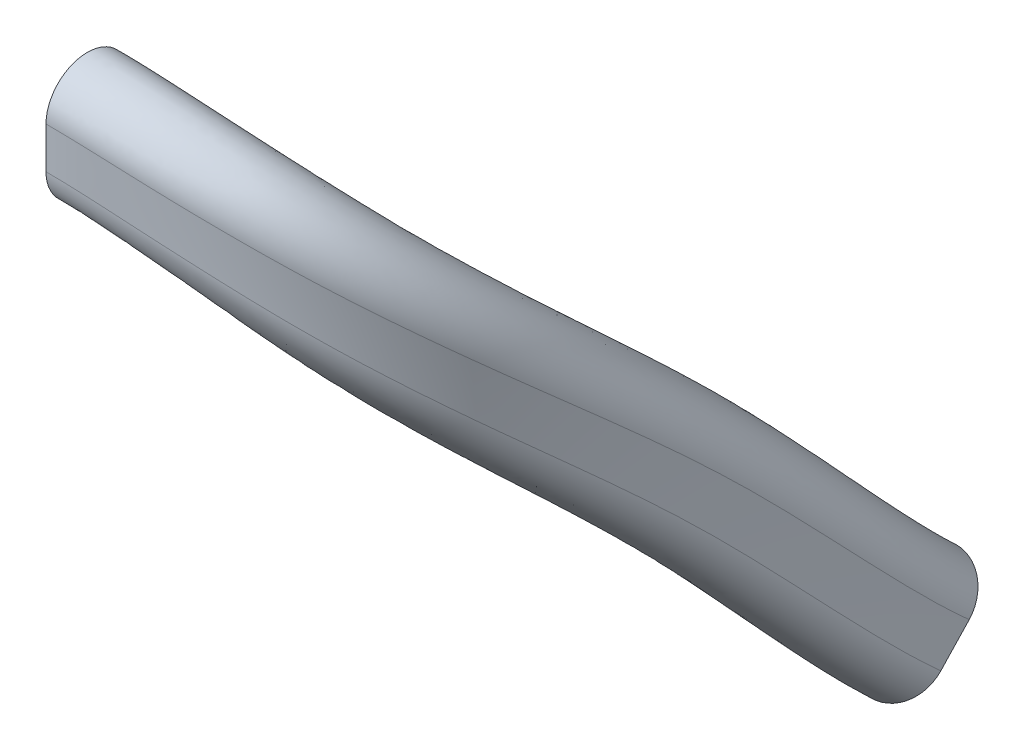
ISO-10303-21;
HEADER;
FILE_DESCRIPTION(('STEP AP214'),'2;1');
FILE_NAME('part.step','',(''),(''),'','','');
FILE_SCHEMA(('AUTOMOTIVE_DESIGN { 1 0 10303 214 1 1 1 1 }'));
ENDSEC;
DATA;
#1=APPLICATION_CONTEXT('core data for automotive mechanical design processes');
#2=APPLICATION_PROTOCOL_DEFINITION('international standard','automotive_design',2000,#1);
#3=PRODUCT_CONTEXT('',#1,'mechanical');
#4=PRODUCT('Part','Part','',(#3));
#5=PRODUCT_RELATED_PRODUCT_CATEGORY('part','',(#4));
#6=PRODUCT_DEFINITION_FORMATION('','',#4);
#7=PRODUCT_DEFINITION_CONTEXT('part definition',#1,'design');
#8=PRODUCT_DEFINITION('design','',#6,#7);
#9=PRODUCT_DEFINITION_SHAPE('','',#8);
#10=(LENGTH_UNIT() NAMED_UNIT(*) SI_UNIT(.MILLI.,.METRE.));
#11=(NAMED_UNIT(*) PLANE_ANGLE_UNIT() SI_UNIT($,.RADIAN.));
#12=(NAMED_UNIT(*) SI_UNIT($,.STERADIAN.) SOLID_ANGLE_UNIT());
#13=UNCERTAINTY_MEASURE_WITH_UNIT(LENGTH_MEASURE(1.E-05),#10,'distance_accuracy_value','');
#14=(GEOMETRIC_REPRESENTATION_CONTEXT(3) GLOBAL_UNCERTAINTY_ASSIGNED_CONTEXT((#13)) GLOBAL_UNIT_ASSIGNED_CONTEXT((#10,
#11,#12)) REPRESENTATION_CONTEXT('',''));
#15=CARTESIAN_POINT('',(0.,0.,0.));
#16=DIRECTION('',(0.,0.,1.));
#17=DIRECTION('',(1.,0.,0.));
#18=AXIS2_PLACEMENT_3D('',#15,#16,#17);
#19=CARTESIAN_POINT('',(413.1845609565,-23.15836263139,21.8154166076));
#20=DIRECTION('',(0.,-0.685686486292979,-0.72789699993556));
#21=DIRECTION('',(0.,0.72789699993556,-0.685686486292979));
#22=AXIS2_PLACEMENT_3D('',#19,#20,#21);
#23=PLANE('',#22);
#24=DIRECTION('',(-1.56449652797247E-12,0.727896999935638,-0.685686486292896));
#25=VECTOR('',#24,1.);
#26=CARTESIAN_POINT('',(415.000000000008,3.88055473171667E-11,3.98047480393293E-11));
#27=LINE('',#26,#25);
#28=CARTESIAN_POINT('',(415.000000000022,-7.27896999933443,6.85686486294034));
#29=VERTEX_POINT('',#28);
#30=CARTESIAN_POINT('',(414.999999999992,7.2789699993872,-6.85686486290666));
#31=VERTEX_POINT('',#30);
#32=EDGE_CURVE('E75',#29,#31,#27,.T.);
#33=ORIENTED_EDGE('',*,*,#32,.T.);
#34=CARTESIAN_POINT('',(435.000000000019,7.27896999940509,-6.85686486294111));
#35=DIRECTION('',(-2.70670434217329E-13,0.685686486292935,0.727896999935601));
#36=DIRECTION('',(0.,-0.727896999935601,0.685686486292935));
#37=AXIS2_PLACEMENT_3D('',#34,#35,#36);
#38=CIRCLE('',#37,19.9999999999932);
#39=CARTESIAN_POINT('',(454.999999999985,7.27896999939132,-6.85686486292845));
#40=VERTEX_POINT('',#39);
#41=EDGE_CURVE('E66',#40,#31,#38,.T.);
#42=ORIENTED_EDGE('',*,*,#41,.F.);
#43=DIRECTION('',(1.03595040365759E-12,-0.727896999935656,0.685686486292877));
#44=VECTOR('',#43,1.);
#45=CARTESIAN_POINT('',(455.000000000002,4.24961715123073E-11,4.73939464062934E-11));
#46=LINE('',#45,#44);
#47=CARTESIAN_POINT('',(455.000000000013,-7.27896999932128,6.85686486293566));
#48=VERTEX_POINT('',#47);
#49=EDGE_CURVE('E64',#40,#48,#46,.T.);
#50=ORIENTED_EDGE('',*,*,#49,.T.);
#51=CARTESIAN_POINT('',(435.000000000004,-7.27896999933604,6.85686486290629));
#52=DIRECTION('',(1.46367248110754E-13,0.685686486292689,0.727896999935833));
#53=DIRECTION('',(0.,-0.727896999935833,0.685686486292689));
#54=AXIS2_PLACEMENT_3D('',#51,#52,#53);
#55=CIRCLE('',#54,20.0000000000122);
#56=EDGE_CURVE('E20',#29,#48,#55,.T.);
#57=ORIENTED_EDGE('',*,*,#56,.F.);
#58=EDGE_LOOP('',(#33,#42,#50,#57));
#59=FACE_BOUND('',#58,.T.);
#60=ADVANCED_FACE('F16',(#59),#23,.T.);
#61=CARTESIAN_POINT('',(272.4028175748,261.7436177551,261.459948329));
#62=CARTESIAN_POINT('',(272.6707537906,253.8708678764,261.4640883951));
#63=CARTESIAN_POINT('',(272.9386900064,245.9981179977,261.4682284613));
#64=CARTESIAN_POINT('',(273.2066262222,238.1253681191,261.4723685274));
#65=CARTESIAN_POINT('',(273.9264768178,261.7917233952,261.4863573519));
#66=CARTESIAN_POINT('',(274.1030725775,253.9161337637,261.4877517269));
#67=CARTESIAN_POINT('',(274.2796683372,246.0405441321,261.4891461019));
#68=CARTESIAN_POINT('',(274.4562640969,238.1649545006,261.4905404768));
#69=CARTESIAN_POINT('',(283.8289619529,261.9449201529,261.5744852173));
#70=CARTESIAN_POINT('',(283.4289461044,254.0604824261,261.566872302));
#71=CARTESIAN_POINT('',(283.0289302558,246.1760446992,261.5592593867));
#72=CARTESIAN_POINT('',(282.6289144073,238.2916069724,261.5516464715));
#73=CARTESIAN_POINT('',(302.6870459212,260.401574451,260.6866611904));
#74=CARTESIAN_POINT('',(301.3716066633,252.6062748367,260.769790161));
#75=CARTESIAN_POINT('',(300.0561674054,244.8109752225,260.8529191317));
#76=CARTESIAN_POINT('',(298.7407281475,237.0156756083,260.9360481023));
#77=CARTESIAN_POINT('',(328.317059903,254.6976700564,256.1709689124));
#78=CARTESIAN_POINT('',(325.9433558489,247.171906392,256.6702245659));
#79=CARTESIAN_POINT('',(323.5696517949,239.6461427277,257.1694802193));
#80=CARTESIAN_POINT('',(321.1959477408,232.1203790633,257.6687358728));
#81=CARTESIAN_POINT('',(352.9050093055,245.6378260684,247.5088724853));
#82=CARTESIAN_POINT('',(349.6590255849,238.5390349563,248.7980893361));
#83=CARTESIAN_POINT('',(346.4130418644,231.4402438442,250.087306187));
#84=CARTESIAN_POINT('',(343.1670581438,224.3414527321,251.3765230378));
#85=CARTESIAN_POINT('',(374.6337266915,233.3328784658,234.715419068));
#86=CARTESIAN_POINT('',(370.9615844208,226.7421701002,237.0781355648));
#87=CARTESIAN_POINT('',(367.2894421501,220.1514617347,239.4408520616));
#88=CARTESIAN_POINT('',(363.6172998794,213.5607533691,241.8035685583));
#89=CARTESIAN_POINT('',(393.0411629907,218.5862533382,217.9657038454));
#90=CARTESIAN_POINT('',(389.6308057927,212.3126958335,221.3388672258));
#91=CARTESIAN_POINT('',(386.2204485946,206.0391383288,224.7120306063));
#92=CARTESIAN_POINT('',(382.8100913965,199.7655808242,228.0851939867));
#93=CARTESIAN_POINT('',(408.4054169314,201.4608977037,197.6745600587));
#94=CARTESIAN_POINT('',(405.5467575603,195.3294231249,201.7358570951));
#95=CARTESIAN_POINT('',(402.6880981892,189.1979485461,205.7971541314));
#96=CARTESIAN_POINT('',(399.8294388182,183.0664739673,209.8584511677));
#97=CARTESIAN_POINT('',(421.3548905582,181.7986143432,173.9791121941));
#98=CARTESIAN_POINT('',(419.0817640359,175.7300733795,178.4728807791));
#99=CARTESIAN_POINT('',(416.8086375136,169.6615324158,182.966649364));
#100=CARTESIAN_POINT('',(414.5355109914,163.5929914521,187.460417949));
#101=CARTESIAN_POINT('',(432.0699072547,159.5524986422,147.0881824283));
#102=CARTESIAN_POINT('',(430.2989697974,153.5529876421,151.8854202555));
#103=CARTESIAN_POINT('',(428.5280323401,147.553476642,156.6826580827));
#104=CARTESIAN_POINT('',(426.7570948828,141.5539656418,161.4798959099));
#105=CARTESIAN_POINT('',(439.0729108702,139.0160684593,123.1669922898));
#106=CARTESIAN_POINT('',(437.6103260135,133.1631789359,128.2369301848));
#107=CARTESIAN_POINT('',(436.1477411568,127.3102894124,133.3068680797));
#108=CARTESIAN_POINT('',(434.6851563001,121.457399889,138.3768059747));
#109=CARTESIAN_POINT('',(443.8423408368,120.4491723546,102.9147838979));
#110=CARTESIAN_POINT('',(442.588724979,114.7673542041,108.2269627714));
#111=CARTESIAN_POINT('',(441.3351091212,109.0855360536,113.5391416449));
#112=CARTESIAN_POINT('',(440.0814932634,103.4037179031,118.8513205184));
#113=CARTESIAN_POINT('',(446.962222127,105.4752599254,87.41047713926));
#114=CARTESIAN_POINT('',(445.8449872581,99.95663499193,92.92145172114));
#115=CARTESIAN_POINT('',(444.7277523891,94.43801005845,98.43242630301));
#116=CARTESIAN_POINT('',(443.6105175202,88.91938512498,103.9434008849));
#117=CARTESIAN_POINT('',(449.7319916146,88.68934781918,70.93005838799));
#118=CARTESIAN_POINT('',(448.7775949845,83.30834730992,76.60441848509));
#119=CARTESIAN_POINT('',(447.8231983545,77.92734680067,82.27877858219));
#120=CARTESIAN_POINT('',(446.8688017244,72.54634629141,87.95313867929));
#121=CARTESIAN_POINT('',(452.7033177773,65.44187622773,48.71338395388));
#122=CARTESIAN_POINT('',(451.9955752228,60.1315892003,54.49061923712));
#123=CARTESIAN_POINT('',(451.2878326684,54.82130217288,60.26785452037));
#124=CARTESIAN_POINT('',(450.580090114,49.51101514545,66.04508980361));
#125=CARTESIAN_POINT('',(454.9978904735,35.03872779599,19.83450366561));
#126=CARTESIAN_POINT('',(454.6345418653,29.6735943622,25.59606635514));
#127=CARTESIAN_POINT('',(454.2711932571,24.30846092841,31.35762904467));
#128=CARTESIAN_POINT('',(453.9078446489,18.94332749462,37.1191917342));
#129=CARTESIAN_POINT('',(455.1839402113,15.52215381614,-0.2926107207714));
#130=CARTESIAN_POINT('',(455.0823244933,9.925299626344,5.255463679759));
#131=CARTESIAN_POINT('',(454.9807087752,4.32844543655,10.80353808029));
#132=CARTESIAN_POINT('',(454.8790930572,-1.268408753243,16.35161248082));
#133=CARTESIAN_POINT('',(454.9564783154,6.777123548825,-10.14549170093));
#134=CARTESIAN_POINT('',(454.9830721556,1.008560256883,-4.781670623982));
#135=CARTESIAN_POINT('',(455.0096659958,-4.76000303506,0.5821504529684));
#136=CARTESIAN_POINT('',(455.036259836,-10.528566327,5.945971529919));
#137=CARTESIAN_POINT('',(454.9297346762,5.889931777863,-11.15580102144));
#138=CARTESIAN_POINT('',(454.9694666567,0.1031075879783,-5.811795130357));
#139=CARTESIAN_POINT('',(455.0091986372,-5.683716601906,-0.4677892392733));
#140=CARTESIAN_POINT('',(455.0489306176,-11.47054079179,4.87621665181));
#141=B_SPLINE_SURFACE_WITH_KNOTS('',3,3,((#61,#62,#63,#64),(#65,#66,#67,#68),(#69,#70,#71,#72),
(#73,#74,#75,#76),(#77,#78,#79,#80),(#81,#82,#83,#84),(#85,#86,#87,#88),(#89,#90,#91,#92),(#93,
#94,#95,#96),(#97,#98,#99,#100),(#101,#102,#103,#104),(#105,#106,#107,#108),(#109,#110,#111,
#112),(#113,#114,#115,#116),(#117,#118,#119,#120),(#121,#122,#123,#124),(#125,#126,#127,#128),
(#129,#130,#131,#132),(#133,#134,#135,#136),(#137,#138,#139,#140)),.UNSPECIFIED.,.F.,.F.,.F.,(4,
1,1,1,1,1,1,1,1,1,1,1,1,1,1,1,1,4),(4,4),(-0.01408916439429,0.,0.07692307692308,0.1538461538462,
0.2307692307692,0.3076923076923,0.3846153846154,0.4615384615385,0.5384615384615,0.6153846153846,
0.6923076923077,0.7292307692308,0.7692307692308,0.8061538461538,0.8461538461538,0.9230769230769,
1.,1.008862046223),(-0.09077195217446,1.090771952174),.UNSPECIFIED.);
#142=CARTESIAN_POINT('',(272.412411822386,259.927491988503,261.460002700694));
#143=CARTESIAN_POINT('',(273.932177717889,259.976055362335,261.48636864238));
#144=CARTESIAN_POINT('',(283.718665759421,260.129235879899,261.573572234654));
#145=CARTESIAN_POINT('',(302.383870586896,258.60495590506,260.705820306485));
#146=CARTESIAN_POINT('',(327.769981415051,252.963172700278,256.286034658531));
#147=CARTESIAN_POINT('',(352.156892511966,244.001735039646,247.806004220851));
#148=CARTESIAN_POINT('',(373.787391177418,231.813887603824,235.259965203054));
#149=CARTESIAN_POINT('',(392.255162286006,217.140357693448,218.743132319911));
#150=CARTESIAN_POINT('',(407.746568561709,200.04774856421,198.610585861037));
#151=CARTESIAN_POINT('',(420.830992636416,180.399969803298,175.014811702822));
#152=CARTESIAN_POINT('',(431.661751155907,158.169763755451,148.193823888646));
#153=CARTESIAN_POINT('',(438.735822213093,137.66712609851,124.335484188708));
#154=CARTESIAN_POINT('',(443.553414225707,119.139657599738,104.139106188971));
#155=CARTESIAN_POINT('',(446.704727869653,104.203357061638,88.680616791317));
#156=CARTESIAN_POINT('',(449.512027434855,87.4491638892823,72.2378542510015));
#157=CARTESIAN_POINT('',(452.540201096495,64.2179899591364,50.0448899340773));
#158=CARTESIAN_POINT('',(454.914147849081,33.8022008239336,21.1623975110739));
#159=CARTESIAN_POINT('',(455.160629290076,14.223569262063,0.977159602695218));
#160=CARTESIAN_POINT('',(454.962275380364,5.43288512453669,-8.92586163416008));
#161=CARTESIAN_POINT('',(454.938313745895,4.53451260296742,-9.9488550748594));
#162=B_SPLINE_CURVE_WITH_KNOTS('',3,(#142,#143,#144,#145,#146,#147,#148,#149,#150,#151,#152,
#153,#154,#155,#156,#157,#158,#159,#160,#161),.UNSPECIFIED.,.F.,.F.,(4,1,1,1,1,1,1,1,1,1,1,1,1,
1,1,1,1,4),(-0.01425219685511,0.,0.07692307692308,0.1538461538462,0.2307692307692,
0.3076923076923,0.3846153846154,0.4615384615385,0.5384615384615,0.6153846153846,0.6923076923077,
0.7292307692308,0.7692307692308,0.8061538461538,0.8461538461538,0.9230769230769,1.,
1.008933979068),.UNSPECIFIED.);
#163=CARTESIAN_POINT('',(276.999999999968,259.999999999987,261.500000000008));
#164=VERTEX_POINT('',#163);
#165=EDGE_CURVE('E86',#164,#40,#162,.T.);
#166=DIRECTION('',(0.,-1.,0.));
#167=VECTOR('',#166,1.);
#168=CARTESIAN_POINT('',(277.,250.,261.500000000009));
#169=LINE('',#168,#167);
#170=CARTESIAN_POINT('',(277.000000000002,240.00000000007,261.500000000013));
#171=VERTEX_POINT('',#170);
#172=EDGE_CURVE('E73',#164,#171,#169,.T.);
#173=CARTESIAN_POINT('',(272.616848387602,239.921913038567,261.463068124727));
#174=CARTESIAN_POINT('',(274.059035887635,239.974166218423,261.487316756413));
#175=CARTESIAN_POINT('',(282.5311091536,240.123860674632,261.560810110348));
#176=CARTESIAN_POINT('',(299.0439034818,238.812294154183,260.916888986178));
#177=CARTESIAN_POINT('',(321.743026228727,233.854876419404,257.553670126685));
#178=CARTESIAN_POINT('',(343.915174937329,225.977543760816,251.07939130224));
#179=CARTESIAN_POINT('',(364.463635393506,215.079744231008,241.259022423235));
#180=CARTESIAN_POINT('',(383.596092101184,201.211476468927,227.307765512161));
#181=CARTESIAN_POINT('',(400.488287187924,184.479623106739,208.922425365396));
#182=CARTESIAN_POINT('',(415.059408913072,164.991635991919,186.424718440286));
#183=CARTESIAN_POINT('',(427.165250981607,142.936700528509,160.374254449548));
#184=CARTESIAN_POINT('',(435.022244957182,122.806342249762,137.208314075813));
#185=CARTESIAN_POINT('',(440.370419874436,104.713232657949,117.626998227326));
#186=CARTESIAN_POINT('',(443.868011777633,90.1912879887327,102.673261232804));
#187=CARTESIAN_POINT('',(447.088765904194,73.7865302212987,86.6453428162863));
#188=CARTESIAN_POINT('',(450.743206794793,50.7349014140248,64.7135838234251));
#189=CARTESIAN_POINT('',(453.991587273429,20.1798544666681,35.7912978887515));
#190=CARTESIAN_POINT('',(454.900737372603,0.0608154829745819,15.113305388392));
#191=CARTESIAN_POINT('',(455.029182222886,-9.13086401121578,4.78637862762002));
#192=CARTESIAN_POINT('',(455.038724546976,-10.0360898952769,3.75893790720444));
#193=B_SPLINE_CURVE_WITH_KNOTS('',3,(#173,#174,#175,#176,#177,#178,#179,#180,#181,#182,#183,
#184,#185,#186,#187,#188,#189,#190,#191,#192),.UNSPECIFIED.,.F.,.F.,(4,1,1,1,1,1,1,1,1,1,1,1,1,
1,1,1,1,4),(-0.01604394595411,0.,0.07692307692308,0.1538461538462,0.2307692307692,
0.3076923076923,0.3846153846154,0.4615384615385,0.5384615384615,0.6153846153846,0.6923076923077,
0.7292307692308,0.7692307692308,0.8061538461538,0.8461538461538,0.9230769230769,1.,
1.008544904292),.UNSPECIFIED.);
#194=EDGE_CURVE('E61',#48,#171,#193,.F.);
#195=ORIENTED_EDGE('',*,*,#49,.F.);
#196=ORIENTED_EDGE('',*,*,#165,.F.);
#197=ORIENTED_EDGE('',*,*,#172,.T.);
#198=ORIENTED_EDGE('',*,*,#194,.F.);
#199=EDGE_LOOP('',(#195,#196,#197,#198));
#200=FACE_BOUND('',#199,.T.);
#201=ADVANCED_FACE('F72',(#200),#141,.F.);
#202=CARTESIAN_POINT('',(272.5478425144,241.7336123042,261.3794966766));
#203=CARTESIAN_POINT('',(274.0136656154,241.7867067705,261.4045636304));
#204=CARTESIAN_POINT('',(282.618907799,241.9387621918,261.48045088));
#205=CARTESIAN_POINT('',(299.3386452969,240.6064487105,260.8156217243));
#206=CARTESIAN_POINT('',(322.2705361113,235.586992251,257.3582858304));
#207=CARTESIAN_POINT('',(344.6303920787,227.6113890992,250.706283993));
#208=CARTESIAN_POINT('',(365.2632764883,216.596649943,240.6459692499));
#209=CARTESIAN_POINT('',(384.3225384768,202.6553873566,226.4727082104));
#210=CARTESIAN_POINT('',(401.0785649972,185.8908324195,207.9401687014));
#211=CARTESIAN_POINT('',(415.5088895363,166.3883606419,185.3532092477));
#212=CARTESIAN_POINT('',(427.4954485049,144.3175372789,159.2416389686));
#213=CARTESIAN_POINT('',(435.2796985907,124.1534331219,136.01864831));
#214=CARTESIAN_POINT('',(440.5787907209,106.0209495202,116.385467289));
#215=CARTESIAN_POINT('',(444.0444363084,91.46144382785,101.3885283328));
#216=CARTESIAN_POINT('',(447.2272132729,75.025016147,85.32569212738));
#217=CARTESIAN_POINT('',(450.8243316994,51.95710476352,63.37390146751));
#218=CARTESIAN_POINT('',(453.9929843893,21.41468829317,34.45998494917));
#219=CARTESIAN_POINT('',(454.8418925813,1.348865923879,13.83470223492));
#220=CARTESIAN_POINT('',(454.9409425326,-7.803472044943,3.551930319601));
#221=CARTESIAN_POINT('',(454.9475720297,-8.704649227117,2.529071074882));
#222=CARTESIAN_POINT('',(273.0144990924,229.2169482711,262.5280034348));
#223=CARTESIAN_POINT('',(274.3202727829,229.2642304594,262.5474716044));
#224=CARTESIAN_POINT('',(282.0249684784,229.3999744501,262.6070007966));
#225=CARTESIAN_POINT('',(297.3579340815,228.2109975278,262.0850361682));
#226=CARTESIAN_POINT('',(318.7566266869,223.6201540777,259.2664552559));
#227=CARTESIAN_POINT('',(339.9102125352,216.3234819004,253.8139051206));
#228=CARTESIAN_POINT('',(360.0545945546,206.1166549863,245.3618735603));
#229=CARTESIAN_POINT('',(379.7093319663,192.6796988869,232.6491454077));
#230=CARTESIAN_POINT('',(397.4698794061,176.141072521,215.0560152145));
#231=CARTESIAN_POINT('',(412.9147892043,156.7386723508,193.0143369914));
#232=CARTESIAN_POINT('',(425.7511204583,134.7776152747,167.2643081617));
#233=CARTESIAN_POINT('',(434.0502498033,114.8466545696,144.3958254184));
#234=CARTESIAN_POINT('',(439.6952920601,96.98619804366,125.0939974146));
#235=CARTESIAN_POINT('',(443.385510554,82.68619386805,110.3778300265));
#236=CARTESIAN_POINT('',(446.8341320921,66.46856721765,94.53755592837));
#237=CARTESIAN_POINT('',(450.831103302,43.51314886203,72.69891648264));
#238=CARTESIAN_POINT('',(454.5538117574,12.883470979,43.69411229121));
#239=CARTESIAN_POINT('',(455.8196947324,-7.550014222688,22.67922873074));
#240=CARTESIAN_POINT('',(456.1217827529,-16.9741548383,12.07775912766));
#241=CARTESIAN_POINT('',(456.1485274394,-17.90330368346,11.02188008819));
#242=CARTESIAN_POINT('',(273.5252847929,219.9356777957,254.0549837677));
#243=CARTESIAN_POINT('',(274.6594129583,219.9786501037,254.069405043));
#244=CARTESIAN_POINT('',(281.3781233911,220.1022989548,254.1138512817));
#245=CARTESIAN_POINT('',(294.9814387029,219.0196079702,253.7236977465));
#246=CARTESIAN_POINT('',(314.0195685422,214.7465866857,251.566202275));
#247=CARTESIAN_POINT('',(332.8001192595,207.9533507267,247.4667509757));
#248=CARTESIAN_POINT('',(351.0350587635,198.345601332,241.0147086221));
#249=CARTESIAN_POINT('',(369.6654075067,185.2825951042,230.5808964356));
#250=CARTESIAN_POINT('',(387.1298320036,168.9114977358,214.9506722117));
#251=CARTESIAN_POINT('',(402.6438630172,149.5833019745,194.4781803092));
#252=CARTESIAN_POINT('',(415.6912136325,127.7036380392,169.9861205158));
#253=CARTESIAN_POINT('',(424.1712091519,107.9455562602,148.0277168816));
#254=CARTESIAN_POINT('',(429.9609877734,90.28681137727,129.4119715811));
#255=CARTESIAN_POINT('',(433.7546718652,76.17923097838,115.1930163633));
#256=CARTESIAN_POINT('',(437.3437989862,60.12384816056,99.82272272979));
#257=CARTESIAN_POINT('',(441.5748416481,37.25184485991,78.48013021895));
#258=CARTESIAN_POINT('',(445.6556121702,6.557461495373,49.9477755565));
#259=CARTESIAN_POINT('',(447.2180240403,-14.14865051665,29.05934276432));
#260=CARTESIAN_POINT('',(447.6714078083,-23.77433635821,18.44426386311));
#261=CARTESIAN_POINT('',(447.7132141896,-24.72422655819,17.38622381528));
#262=CARTESIAN_POINT('',(273.7474706555,219.9356777957,241.4798150239));
#263=CARTESIAN_POINT('',(274.8101681364,219.9786501037,241.4930288728));
#264=CARTESIAN_POINT('',(281.0997314225,220.1022989548,241.533492391));
#265=CARTESIAN_POINT('',(293.7572229301,219.0196079702,241.1782339548));
#266=CARTESIAN_POINT('',(311.1451106134,214.7465866857,239.2735192436));
#267=CARTESIAN_POINT('',(327.9316709301,207.9533507267,235.7993969744));
#268=CARTESIAN_POINT('',(344.0800504426,198.345601332,230.4362445282));
#269=CARTESIAN_POINT('',(360.7334395318,185.2825951042,221.6152314501));
#270=CARTESIAN_POINT('',(376.7939935375,168.9114977358,207.6927607756));
#271=CARTESIAN_POINT('',(391.3866557363,149.5833019745,188.7911826216));
#272=CARTESIAN_POINT('',(403.8688134733,127.7036380392,165.6340706509));
#273=CARTESIAN_POINT('',(412.0778447391,107.9455562602,144.5484861664));
#274=CARTESIAN_POINT('',(417.7168638015,90.28681137727,126.5266347445));
#275=CARTESIAN_POINT('',(421.4255080531,76.17923097838,112.6974452202));
#276=CARTESIAN_POINT('',(424.9382755618,60.12384816056,97.73840223097));
#277=CARTESIAN_POINT('',(429.0851327544,37.25184485991,76.95162433832));
#278=CARTESIAN_POINT('',(433.0947278026,6.557461495373,49.14729986545));
#279=CARTESIAN_POINT('',(434.6400619261,-14.14865051665,28.81899864452));
#280=CARTESIAN_POINT('',(435.0944441351,-23.77433635821,18.50426401567));
#281=CARTESIAN_POINT('',(435.1364474357,-24.72422655819,17.47632944008));
#282=CARTESIAN_POINT('',(273.969656518,219.9356777957,228.9046462801));
#283=CARTESIAN_POINT('',(274.9609233146,219.9786501037,228.9166527026));
#284=CARTESIAN_POINT('',(280.821339454,220.1022989548,228.9531335003));
#285=CARTESIAN_POINT('',(292.5330071573,219.0196079702,228.6327701631));
#286=CARTESIAN_POINT('',(308.2706526846,214.7465866857,226.9808362121));
#287=CARTESIAN_POINT('',(323.0632226007,207.9533507267,224.132042973));
#288=CARTESIAN_POINT('',(337.1250421217,198.345601332,219.8577804343));
#289=CARTESIAN_POINT('',(351.8014715569,185.2825951042,212.6495664646));
#290=CARTESIAN_POINT('',(366.4581550715,168.9114977358,200.4348493396));
#291=CARTESIAN_POINT('',(380.1294484555,149.5833019745,183.1041849341));
#292=CARTESIAN_POINT('',(392.0464133142,127.7036380392,161.282020786));
#293=CARTESIAN_POINT('',(399.9844803263,107.9455562602,141.0692554512));
#294=CARTESIAN_POINT('',(405.4727398295,90.28681137727,123.6412979079));
#295=CARTESIAN_POINT('',(409.096344241,76.17923097838,110.2018740771));
#296=CARTESIAN_POINT('',(412.5327521373,60.12384816056,95.65408173215));
#297=CARTESIAN_POINT('',(416.5954238607,37.25184485991,75.42311845769));
#298=CARTESIAN_POINT('',(420.5338434349,6.557461495373,48.3468241744));
#299=CARTESIAN_POINT('',(422.0620998118,-14.14865051665,28.57865452471));
#300=CARTESIAN_POINT('',(422.5174804619,-23.77433635821,18.56426416823));
#301=CARTESIAN_POINT('',(422.5596806818,-24.72422655819,17.56643506488));
#302=CARTESIAN_POINT('',(273.7585092993,229.2169482711,220.4188710555));
#303=CARTESIAN_POINT('',(274.8250906412,229.2642304594,220.4342960446));
#304=CARTESIAN_POINT('',(281.0927468522,229.3999744501,220.4804887235));
#305=CARTESIAN_POINT('',(293.2585327067,228.2109975278,220.075373608));
#306=CARTESIAN_POINT('',(309.1312346218,223.6201540777,218.1032527882));
#307=CARTESIAN_POINT('',(323.6077565316,216.3234819004,214.7446755805));
#308=CARTESIAN_POINT('',(336.765096652,206.1166549863,209.9388940382));
#309=CARTESIAN_POINT('',(349.799799178,192.6796988869,202.6267750176));
#310=CARTESIAN_POINT('',(362.8593545627,176.141072521,190.7522178116));
#311=CARTESIAN_POINT('',(375.2189744389,156.7386723508,173.9708916633));
#312=CARTESIAN_POINT('',(386.1627043118,134.7776152747,152.6910608665));
#313=CARTESIAN_POINT('',(393.5544844308,114.8466545696,132.7452949365));
#314=CARTESIAN_POINT('',(398.694694159,96.98619804366,115.4321763061));
#315=CARTESIAN_POINT('',(402.1001487696,82.68619386805,102.0211759118));
#316=CARTESIAN_POINT('',(405.2930729813,66.46856721765,87.55801318078));
#317=CARTESIAN_POINT('',(409.008141249,43.51314886203,67.58057113227));
#318=CARTESIAN_POINT('',(412.4925119518,12.883470979,41.01364433666));
#319=CARTESIAN_POINT('',(413.70120849,-7.550014222688,21.87441389576));
#320=CARTESIAN_POINT('',(414.0066398843,-16.9741548383,12.2786752679));
#321=CARTESIAN_POINT('',(414.0340439735,-17.90330368346,11.32360722681));
#322=CARTESIAN_POINT('',(273.2515716019,241.7336123042,221.5501757477));
#323=CARTESIAN_POINT('',(274.4911523588,241.7867067705,221.5714184209));
#324=CARTESIAN_POINT('',(281.7371571614,241.9387621918,221.6346912033));
#325=CARTESIAN_POINT('',(295.4611877538,240.6064487105,221.0803852642));
#326=CARTESIAN_POINT('',(313.1662680353,235.586992251,218.4236816504));
#327=CARTESIAN_POINT('',(329.2105599566,227.6113890992,213.7522839015));
#328=CARTESIAN_POINT('',(343.2346847358,216.596649943,207.1408092068));
#329=CARTESIAN_POINT('',(356.0323241469,202.6553873566,198.0757653681));
#330=CARTESIAN_POINT('',(368.3418728922,185.8908324195,184.9521921781));
#331=CARTESIAN_POINT('',(379.8539467927,166.3883606419,167.3407864617));
#332=CARTESIAN_POINT('',(390.0503708538,144.3175372789,145.4573952499));
#333=CARTESIAN_POINT('',(396.9763960967,124.1534331219,124.9988839184));
#334=CARTESIAN_POINT('',(401.7979876074,106.0209495202,107.246742458));
#335=CARTESIAN_POINT('',(404.994286584,91.46144382785,93.48430804098));
#336=CARTESIAN_POINT('',(407.9352098152,75.025016147,78.72402564025));
#337=CARTESIAN_POINT('',(411.2656876788,51.95710476352,58.53266613289));
#338=CARTESIAN_POINT('',(414.2089063523,21.41468829317,31.92463899524));
#339=CARTESIAN_POINT('',(415.0037242126,1.348865923879,13.07346051514));
#340=CARTESIAN_POINT('',(415.1059365256,-7.803472044943,3.741968750153));
#341=CARTESIAN_POINT('',(415.1131897249,-8.704649227117,2.814462541251));
#342=(BOUNDED_SURFACE() B_SPLINE_SURFACE(3,3,((#202,#203,#204,#205,#206,#207,#208,#209,#210,
#211,#212,#213,#214,#215,#216,#217,#218,#219,#220,#221),(#222,#223,#224,#225,#226,#227,#228,
#229,#230,#231,#232,#233,#234,#235,#236,#237,#238,#239,#240,#241),(#242,#243,#244,#245,#246,
#247,#248,#249,#250,#251,#252,#253,#254,#255,#256,#257,#258,#259,#260,#261),(#262,#263,#264,
#265,#266,#267,#268,#269,#270,#271,#272,#273,#274,#275,#276,#277,#278,#279,#280,#281),(#282,
#283,#284,#285,#286,#287,#288,#289,#290,#291,#292,#293,#294,#295,#296,#297,#298,#299,#300,#301),
(#302,#303,#304,#305,#306,#307,#308,#309,#310,#311,#312,#313,#314,#315,#316,#317,#318,#319,#320,
#321),(#322,#323,#324,#325,#326,#327,#328,#329,#330,#331,#332,#333,#334,#335,#336,#337,#338,
#339,#340,#341)),.UNSPECIFIED.,.F.,.F.,.F.) B_SPLINE_SURFACE_WITH_KNOTS((4,3,4),(4,1,1,1,1,1,1,
1,1,1,1,1,1,1,1,1,1,4),(0.,1.,2.),(-0.01604394595411,0.,0.07692307692308,0.1538461538462,
0.2307692307692,0.3076923076923,0.3846153846154,0.4615384615385,0.5384615384615,0.6153846153846,
0.6923076923077,0.7292307692308,0.7692307692308,0.8061538461538,0.8461538461538,0.9230769230769,
1.,1.008544904292),
.UNSPECIFIED.) GEOMETRIC_REPRESENTATION_ITEM() RATIONAL_B_SPLINE_SURFACE(((1.194531260396,
1.194531260396,1.194531260396,1.194531260396,1.194531260396,1.194531260396,1.194531260396,
1.194531260396,1.194531260396,1.194531260396,1.194531260396,1.194531260396,1.194531260396,
1.194531260396,1.194531260396,1.194531260396,1.194531260396,1.194531260396,1.194531260396,
1.194531260396),(0.9351562465345,0.9351562465345,0.9351562465345,0.9351562465345,
0.9351562465345,0.9351562465345,0.9351562465345,0.9351562465345,0.9351562465345,0.9351562465345,
0.9351562465345,0.9351562465345,0.9351562465345,0.9351562465345,0.9351562465345,0.9351562465345,
0.9351562465345,0.9351562465345,0.9351562465345,0.9351562465345),(0.9351562465345,
0.9351562465345,0.9351562465345,0.9351562465345,0.9351562465345,0.9351562465345,0.9351562465345,
0.9351562465345,0.9351562465345,0.9351562465345,0.9351562465345,0.9351562465345,0.9351562465345,
0.9351562465345,0.9351562465345,0.9351562465345,0.9351562465345,0.9351562465345,0.9351562465345,
0.9351562465345),(1.194531260396,1.194531260396,1.194531260396,1.194531260396,1.194531260396,
1.194531260396,1.194531260396,1.194531260396,1.194531260396,1.194531260396,1.194531260396,
1.194531260396,1.194531260396,1.194531260396,1.194531260396,1.194531260396,1.194531260396,
1.194531260396,1.194531260396,1.194531260396),(0.9351562465345,0.9351562465345,0.9351562465345,
0.9351562465345,0.9351562465345,0.9351562465345,0.9351562465345,0.9351562465345,0.9351562465345,
0.9351562465345,0.9351562465345,0.9351562465345,0.9351562465345,0.9351562465345,0.9351562465345,
0.9351562465345,0.9351562465345,0.9351562465345,0.9351562465345,0.9351562465345),
(0.9351562465345,0.9351562465345,0.9351562465345,0.9351562465345,0.9351562465345,
0.9351562465345,0.9351562465345,0.9351562465345,0.9351562465345,0.9351562465345,0.9351562465345,
0.9351562465345,0.9351562465345,0.9351562465345,0.9351562465345,0.9351562465345,0.9351562465345,
0.9351562465345,0.9351562465345,0.9351562465345),(1.194531260396,1.194531260396,1.194531260396,
1.194531260396,1.194531260396,1.194531260396,1.194531260396,1.194531260396,1.194531260396,
1.194531260396,1.194531260396,1.194531260396,1.194531260396,1.194531260396,1.194531260396,
1.194531260396,1.194531260396,1.194531260396,1.194531260396,1.194531260396))) REPRESENTATION_ITEM('') SURFACE());
#343=CARTESIAN_POINT('',(276.999999999907,240.000000000115,241.500000000023));
#344=DIRECTION('',(1.,-1.02604491768299E-12,-3.62804611185786E-12));
#345=DIRECTION('',(-3.62804611185786E-12,0.,-1.));
#346=AXIS2_PLACEMENT_3D('',#343,#344,#345);
#347=CIRCLE('',#346,20.0000000000461);
#348=CARTESIAN_POINT('',(276.999999999917,240.000000000061,221.499999999993));
#349=VERTEX_POINT('',#348);
#350=EDGE_CURVE('E88',#171,#349,#347,.T.);
#351=CARTESIAN_POINT('',(273.680855156344,239.936508110117,221.474805539856));
#352=CARTESIAN_POINT('',(274.778862575236,239.978979315045,221.491458469805));
#353=CARTESIAN_POINT('',(281.770636672646,240.111728220288,221.545399565659));
#354=CARTESIAN_POINT('',(295.150416665024,238.812294154157,221.017388450008));
#355=CARTESIAN_POINT('',(312.601121427338,233.854876419445,218.458111656499));
#356=CARTESIAN_POINT('',(328.431597769228,225.977543760844,213.972624668393));
#357=CARTESIAN_POINT('',(342.343978214102,215.079744231028,207.615353221813));
#358=CARTESIAN_POINT('',(355.188927015898,201.211476468897,198.793430702588));
#359=CARTESIAN_POINT('',(367.616262744134,184.479623106771,185.839417352187));
#360=CARTESIAN_POINT('',(379.257069884796,164.991635991922,168.337832929301));
#361=CARTESIAN_POINT('',(389.565376690777,142.936700528524,146.533027149959));
#362=CARTESIAN_POINT('',(396.560597951974,122.806342249785,126.142994364124));
#363=CARTESIAN_POINT('',(401.429298278931,104.713232657964,108.450494227854));
#364=CARTESIAN_POINT('',(404.656430101744,90.1912879887319,94.7363651710867));
#365=CARTESIAN_POINT('',(407.634330680154,73.7865302212993,80.0163852710765));
#366=CARTESIAN_POINT('',(411.021028725104,50.7349014140325,59.8523349914636));
#367=CARTESIAN_POINT('',(414.043043251055,20.1798544666671,33.2454709034307));
#368=CARTESIAN_POINT('',(414.896201705556,0.100301200509015,14.3860031852918));
#369=CARTESIAN_POINT('',(415.02851364811,-9.06229318191273,5.04710474434126));
#370=CARTESIAN_POINT('',(415.03851799847,-9.93474269642495,4.14978262358301));
#371=B_SPLINE_CURVE_WITH_KNOTS('',3,(#351,#352,#353,#354,#355,#356,#357,#358,#359,#360,#361,
#362,#363,#364,#365,#366,#367,#368,#369,#370),.UNSPECIFIED.,.F.,.F.,(4,1,1,1,1,1,1,1,1,1,1,1,1,
1,1,1,1,4),(-0.01447240242826,0.,0.07692307692308,0.1538461538462,0.2307692307692,
0.3076923076923,0.3846153846154,0.4615384615385,0.5384615384615,0.6153846153846,0.6923076923077,
0.7292307692308,0.7692307692308,0.8061538461538,0.8461538461538,0.9230769230769,1.,
1.008226194862),.UNSPECIFIED.);
#372=EDGE_CURVE('E63',#349,#29,#371,.T.);
#373=ORIENTED_EDGE('',*,*,#56,.T.);
#374=ORIENTED_EDGE('',*,*,#194,.T.);
#375=ORIENTED_EDGE('',*,*,#350,.T.);
#376=ORIENTED_EDGE('',*,*,#372,.T.);
#377=EDGE_LOOP('',(#373,#374,#375,#376));
#378=FACE_BOUND('',#377,.T.);
#379=ADVANCED_FACE('F58',(#378),#342,.T.);
#380=CARTESIAN_POINT('',(273.744326584,238.1220934064,221.4758120502));
#381=CARTESIAN_POINT('',(273.4689321233,245.9946082886,221.4714449297));
#382=CARTESIAN_POINT('',(273.1935376626,253.8671231707,221.4670778091));
#383=CARTESIAN_POINT('',(272.9181432019,261.7396380529,221.4627106885));
#384=CARTESIAN_POINT('',(274.8206829346,238.1638733673,221.4917975586));
#385=CARTESIAN_POINT('',(274.6392297085,246.0393874695,221.4903262954));
#386=CARTESIAN_POINT('',(274.4577764824,253.9149015718,221.4888550322));
#387=CARTESIAN_POINT('',(274.2763232563,261.790415674,221.487383769));
#388=CARTESIAN_POINT('',(281.6789246534,238.294518721,221.5435972558));
#389=CARTESIAN_POINT('',(282.0768514531,246.1791598661,221.5514172493));
#390=CARTESIAN_POINT('',(282.4747782529,254.0638010112,221.5592372428));
#391=CARTESIAN_POINT('',(282.8727050527,261.9484421563,221.5670572362));
#392=CARTESIAN_POINT('',(294.8472413307,237.0156756083,221.0365475661));
#393=CARTESIAN_POINT('',(296.1626805886,244.8109752225,220.9534185955));
#394=CARTESIAN_POINT('',(297.4781198465,252.6062748367,220.8702896249));
#395=CARTESIAN_POINT('',(298.7935591045,260.401574451,220.7871606543));
#396=CARTESIAN_POINT('',(312.0540429394,232.1203790633,218.5731774026));
#397=CARTESIAN_POINT('',(314.4277469935,239.6461427277,218.0739217491));
#398=CARTESIAN_POINT('',(316.8014510475,247.171906392,217.5746660957));
#399=CARTESIAN_POINT('',(319.1751551016,254.6976700564,217.0754104422));
#400=CARTESIAN_POINT('',(327.6834809757,224.3414527321,214.269756404));
#401=CARTESIAN_POINT('',(330.9294646963,231.4402438442,212.9805395531));
#402=CARTESIAN_POINT('',(334.1754484168,238.5390349563,211.6913227023));
#403=CARTESIAN_POINT('',(337.4214321374,245.6378260684,210.4021058514));
#404=CARTESIAN_POINT('',(341.4976427,213.5607533691,208.1598993569));
#405=CARTESIAN_POINT('',(345.1697849707,220.1514617347,205.7971828601));
#406=CARTESIAN_POINT('',(348.8419272414,226.7421701002,203.4344663633));
#407=CARTESIAN_POINT('',(352.5140695121,233.3328784658,201.0717498665));
#408=CARTESIAN_POINT('',(354.4029263112,199.7655808242,199.5708591771));
#409=CARTESIAN_POINT('',(357.8132835093,206.0391383288,196.1976957967));
#410=CARTESIAN_POINT('',(361.2236407073,212.3126958335,192.8245324163));
#411=CARTESIAN_POINT('',(364.6339979054,218.5862533382,189.4513690359));
#412=CARTESIAN_POINT('',(366.9574143744,183.0664739673,186.7754431545));
#413=CARTESIAN_POINT('',(369.8160737455,189.1979485461,182.7141461182));
#414=CARTESIAN_POINT('',(372.6747331166,195.3294231249,178.6528490819));
#415=CARTESIAN_POINT('',(375.5333924877,201.4608977037,174.5915520455));
#416=CARTESIAN_POINT('',(378.7331719631,163.5929914521,169.373532438));
#417=CARTESIAN_POINT('',(381.0062984853,169.6615324158,164.879763853));
#418=CARTESIAN_POINT('',(383.2794250076,175.7300733795,160.3859952681));
#419=CARTESIAN_POINT('',(385.5525515299,181.7986143432,155.8922266831));
#420=CARTESIAN_POINT('',(389.157220592,141.5539656418,147.6386686103));
#421=CARTESIAN_POINT('',(390.9281580493,147.553476642,142.8414307831));
#422=CARTESIAN_POINT('',(392.6990955065,153.5529876421,138.0441929559));
#423=CARTESIAN_POINT('',(394.4700329638,159.5524986422,133.2469551287));
#424=CARTESIAN_POINT('',(396.2235092949,121.457399889,127.311486263));
#425=CARTESIAN_POINT('',(397.6860941516,127.3102894124,122.241548368));
#426=CARTESIAN_POINT('',(399.1486790083,133.1631789359,117.171610473));
#427=CARTESIAN_POINT('',(400.611263865,139.0160684593,112.101672578));
#428=CARTESIAN_POINT('',(401.1403716679,103.4037179031,109.6748165189));
#429=CARTESIAN_POINT('',(402.3939875257,109.0855360536,104.3626376454));
#430=CARTESIAN_POINT('',(403.6476033835,114.7673542041,99.0504587718701));
#431=CARTESIAN_POINT('',(404.9012192413,120.4491723546,93.73827989836));
#432=CARTESIAN_POINT('',(404.3989358443,88.91938512498,96.00650482313));
#433=CARTESIAN_POINT('',(405.5161707133,94.43801005845,90.49553024125));
#434=CARTESIAN_POINT('',(406.6334055822,99.95663499193,84.98455565938));
#435=CARTESIAN_POINT('',(407.7506404512,105.4752599254,79.4735810775));
#436=CARTESIAN_POINT('',(407.4143665004,72.54634629141,81.32418113408));
#437=CARTESIAN_POINT('',(408.3687631304,77.92734680067,75.64982103698));
#438=CARTESIAN_POINT('',(409.3231597605,83.30834730992,69.97546093988));
#439=CARTESIAN_POINT('',(410.2775563906,88.68934781918,64.30110084278));
#440=CARTESIAN_POINT('',(410.8579120443,49.51101514545,61.18384097165));
#441=CARTESIAN_POINT('',(411.5656545987,54.82130217288,55.40660568841));
#442=CARTESIAN_POINT('',(412.2733971532,60.1315892003,49.62937040516));
#443=CARTESIAN_POINT('',(412.9811397076,65.44187622773,43.85213512192));
#444=CARTESIAN_POINT('',(413.9593006266,18.94332749462,34.57336474888));
#445=CARTESIAN_POINT('',(414.3226492348,24.30846092841,28.81180205935));
#446=CARTESIAN_POINT('',(414.685997843,29.6735943622,23.05023936982));
#447=CARTESIAN_POINT('',(415.0493464512,35.03872779599,17.28867668029));
#448=CARTESIAN_POINT('',(414.8725461269,-1.189422814024,15.66488568719));
#449=CARTESIAN_POINT('',(414.9751846773,4.40652582855,10.11597699055));
#450=CARTESIAN_POINT('',(415.0778232277,10.00247447112,4.567068293903));
#451=CARTESIAN_POINT('',(415.1804617781,15.5984231137,-0.9818404027424));
#452=CARTESIAN_POINT('',(415.0342046855,-10.39121445089,6.283957867255));
#453=CARTESIAN_POINT('',(415.0095119973,-4.625193901204,0.9174093062915));
#454=CARTESIAN_POINT('',(414.9848193091,1.14082664848,-4.449139254672));
#455=CARTESIAN_POINT('',(414.9601266209,6.906847198165,-9.815687815636));
#456=CARTESIAN_POINT('',(415.0470230534,-11.26755462,5.382420479447));
#457=CARTESIAN_POINT('',(415.0101207006,-5.484653014313,0.03416142667235));
#458=CARTESIAN_POINT('',(414.9732183479,0.2982485913723,-5.314097626102));
#459=CARTESIAN_POINT('',(414.9363159952,6.081150197058,-10.66235667888));
#460=B_SPLINE_SURFACE_WITH_KNOTS('',3,3,((#380,#381,#382,#383),(#384,#385,#386,#387),(#388,#389,
#390,#391),(#392,#393,#394,#395),(#396,#397,#398,#399),(#400,#401,#402,#403),(#404,#405,#406,
#407),(#408,#409,#410,#411),(#412,#413,#414,#415),(#416,#417,#418,#419),(#420,#421,#422,#423),
(#424,#425,#426,#427),(#428,#429,#430,#431),(#432,#433,#434,#435),(#436,#437,#438,#439),(#440,
#441,#442,#443),(#444,#445,#446,#447),(#448,#449,#450,#451),(#452,#453,#454,#455),(#456,#457,
#458,#459)),.UNSPECIFIED.,.F.,.F.,.F.,(4,1,1,1,1,1,1,1,1,1,1,1,1,1,1,1,1,4),(4,4),
(-0.01447240242826,0.,0.07692307692308,0.1538461538462,0.2307692307692,0.3076923076923,
0.3846153846154,0.4615384615385,0.5384615384615,0.6153846153846,0.6923076923077,0.7292307692308,
0.7692307692308,0.8061538461538,0.8461538461538,0.9230769230769,1.,1.008226194862),
(-0.09077195217446,1.090771952174),.UNSPECIFIED.);
#461=DIRECTION('',(0.,1.,0.));
#462=VECTOR('',#461,1.);
#463=CARTESIAN_POINT('',(277.,250.,221.499999999991));
#464=LINE('',#463,#462);
#465=CARTESIAN_POINT('',(276.999999999974,259.999999999994,221.500000000004));
#466=VERTEX_POINT('',#465);
#467=EDGE_CURVE('E26',#349,#466,#464,.T.);
#468=CARTESIAN_POINT('',(273.042625166891,259.927491988517,221.464804829004));
#469=CARTESIAN_POINT('',(274.358924285529,259.97605536235,221.488093622461));
#470=CARTESIAN_POINT('',(282.801545107232,260.129235879914,221.564262036706));
#471=CARTESIAN_POINT('',(298.490383770114,258.604955905074,220.806319770346));
#472=CARTESIAN_POINT('',(318.628076613657,252.963172700292,217.190476188312));
#473=CARTESIAN_POINT('',(336.673315343864,244.001735039659,210.699237587061));
#474=CARTESIAN_POINT('',(351.667733998038,231.813887603837,201.616296001637));
#475=CARTESIAN_POINT('',(363.84799720066,217.14035769346,190.228797510425));
#476=CARTESIAN_POINT('',(374.874544117958,200.047748564221,175.527577847886));
#477=CARTESIAN_POINT('',(385.028653608201,180.39996980331,156.927926191801));
#478=CARTESIAN_POINT('',(394.061876865093,158.169763755462,134.352596589022));
#479=CARTESIAN_POINT('',(400.274175207932,137.667126098521,113.270164476902));
#480=CARTESIAN_POINT('',(404.612292630195,119.139657599749,94.9626021894056));
#481=CARTESIAN_POINT('',(407.493146193702,104.203357061649,80.7437207295391));
#482=CARTESIAN_POINT('',(410.057592210833,87.4491638892926,65.608896705787));
#483=CARTESIAN_POINT('',(412.818023026813,64.2179899591465,45.183641102108));
#484=CARTESIAN_POINT('',(414.965603826688,33.8022008239438,18.6165705257444));
#485=CARTESIAN_POINT('',(415.15764119708,14.2235692620737,0.217039106741853));
#486=CARTESIAN_POINT('',(414.962622422647,5.43288512454769,-8.72634042145376));
#487=CARTESIAN_POINT('',(414.939344968721,4.53451260297846,-9.64920330350811));
#488=B_SPLINE_CURVE_WITH_KNOTS('',3,(#468,#469,#470,#471,#472,#473,#474,#475,#476,#477,#478,
#479,#480,#481,#482,#483,#484,#485,#486,#487),.UNSPECIFIED.,.F.,.F.,(4,1,1,1,1,1,1,1,1,1,1,1,1,
1,1,1,1,4),(-0.01425219685511,0.,0.07692307692308,0.1538461538462,0.2307692307692,
0.3076923076923,0.3846153846154,0.4615384615385,0.5384615384615,0.6153846153846,0.6923076923077,
0.7292307692308,0.7692307692308,0.8061538461538,0.8461538461538,0.9230769230769,1.,
1.008933979068),.UNSPECIFIED.);
#489=EDGE_CURVE('E34',#31,#466,#488,.F.);
#490=ORIENTED_EDGE('',*,*,#32,.F.);
#491=ORIENTED_EDGE('',*,*,#372,.F.);
#492=ORIENTED_EDGE('',*,*,#467,.T.);
#493=ORIENTED_EDGE('',*,*,#489,.F.);
#494=EDGE_LOOP('',(#490,#491,#492,#493));
#495=FACE_BOUND('',#494,.T.);
#496=ADVANCED_FACE('F105',(#495),#460,.F.);
#497=CARTESIAN_POINT('',(273.103736682,258.1155270888,221.5481172468));
#498=CARTESIAN_POINT('',(274.3991686373,258.1634290644,221.5707593996));
#499=CARTESIAN_POINT('',(282.7115644736,258.3145527336,221.6448423366));
#500=CARTESIAN_POINT('',(298.1956417336,256.8108015275,220.9075868023));
#501=CARTESIAN_POINT('',(318.1005667904,251.2310568208,217.3858605462));
#502=CARTESIAN_POINT('',(335.9580981866,242.3678897141,211.0723448798));
#503=CARTESIAN_POINT('',(350.8680929075,230.2969818884,202.2293491794));
#504=CARTESIAN_POINT('',(363.1215508239,215.6964468067,191.063854811));
#505=CARTESIAN_POINT('',(374.284266309,198.6365392512,176.5098345122));
#506=CARTESIAN_POINT('',(384.5791729849,179.0032451534,157.9994353843));
#507=CARTESIAN_POINT('',(393.7316793418,156.788927005,135.48521207));
#508=CARTESIAN_POINT('',(400.0167215745,136.3200352265,114.4598302427));
#509=CARTESIAN_POINT('',(404.4039217836,117.8319407373,96.20413312776));
#510=CARTESIAN_POINT('',(407.3167216635,102.9332012234,82.02845362942));
#511=CARTESIAN_POINT('',(409.9191448401,86.21067796051,66.9285473951));
#512=CARTESIAN_POINT('',(412.7368981338,62.99578662721,46.5233234557));
#513=CARTESIAN_POINT('',(414.9642066218,32.56736686244,19.94788348319));
#514=CARTESIAN_POINT('',(415.216630526,12.93539162707,1.495515931387));
#515=CARTESIAN_POINT('',(415.0511296452,4.105134662983,-7.492294455016));
#516=CARTESIAN_POINT('',(415.0308952161,3.202518173558,-8.419963335061));
#517=CARTESIAN_POINT('',(272.6905292525,270.6340263341,220.4013825987));
#518=CARTESIAN_POINT('',(274.1272226418,270.6864977764,220.4284483183));
#519=CARTESIAN_POINT('',(283.3201256669,270.8518317952,220.5167818097));
#520=CARTESIAN_POINT('',(300.1763544787,269.2062514753,219.6381739469));
#521=CARTESIAN_POINT('',(321.614475805,263.197895325,215.4776906951));
#522=CARTESIAN_POINT('',(340.6782778399,253.6557968243,207.9647238662));
#523=CARTESIAN_POINT('',(356.0767748118,240.7769768689,197.5134448384));
#524=CARTESIAN_POINT('',(367.7347573423,225.6721352701,184.8874176219));
#525=CARTESIAN_POINT('',(377.8929518979,208.3862991515,169.3939879969));
#526=CARTESIAN_POINT('',(387.1732733174,188.652933444,150.3383076412));
#527=CARTESIAN_POINT('',(395.4760073884,166.3288490097,127.4625428767));
#528=CARTESIAN_POINT('',(401.2461703613,145.626813778,106.0826531344));
#529=CARTESIAN_POINT('',(405.2874204453,126.8666922152,87.49560300196));
#530=CARTESIAN_POINT('',(407.975647414,111.7084511772,73.03915193657));
#531=CARTESIAN_POINT('',(410.3122260349,94.76712691115,57.7166835913));
#532=CARTESIAN_POINT('',(412.7301264511,71.43974240739,37.19830845662));
#533=CARTESIAN_POINT('',(414.4033798687,41.09858510931,10.71375601773));
#534=CARTESIAN_POINT('',(414.2378279354,21.83515053196,-7.348076833074));
#535=CARTESIAN_POINT('',(413.8684415208,13.27829422785,-16.01521936766));
#536=CARTESIAN_POINT('',(413.8271932186,12.40499845452,-16.90825467816));
#537=CARTESIAN_POINT('',(272.2371953796,279.9166576434,228.8760016686));
#538=CARTESIAN_POINT('',(273.8260745456,279.9725174052,228.9070649625));
#539=CARTESIAN_POINT('',(283.9852097677,280.1483885846,229.0085382943));
#540=CARTESIAN_POINT('',(302.5528509916,278.3976401173,227.9995135465));
#541=CARTESIAN_POINT('',(326.3515336457,272.0714629624,223.1779433603));
#542=CARTESIAN_POINT('',(347.7883711971,262.0259279322,214.3118780957));
#543=CARTESIAN_POINT('',(365.0963105811,248.5480305409,201.860609754));
#544=CARTESIAN_POINT('',(377.7786818078,233.069239048,186.9556666));
#545=CARTESIAN_POINT('',(388.2329992989,215.615873938,169.4993309981));
#546=CARTESIAN_POINT('',(397.4441995049,195.80830382,148.8744643239));
#547=CARTESIAN_POINT('',(405.5359142142,173.4028262455,124.7407305224));
#548=CARTESIAN_POINT('',(411.1252110123,152.5279120867,102.4507616714));
#549=CARTESIAN_POINT('',(415.0217247328,133.5660788827,83.17762883534));
#550=CARTESIAN_POINT('',(417.6064860998,118.2154140624,68.2239656004));
#551=CARTESIAN_POINT('',(419.8025591512,101.111845984,52.43151678779));
#552=CARTESIAN_POINT('',(421.9863880457,77.70104631956,31.41709473221));
#553=CARTESIAN_POINT('',(423.3015799119,47.42459528456,4.460092660927));
#554=CARTESIAN_POINT('',(422.8387871288,28.43443843673,-13.72849362268));
#555=CARTESIAN_POINT('',(422.3174393263,20.08031230631,-22.38159858425));
#556=CARTESIAN_POINT('',(422.260449444,19.22875822837,-23.2722982325));
#557=CARTESIAN_POINT('',(272.0390395483,279.9166576434,241.451555247));
#558=CARTESIAN_POINT('',(273.6918940786,279.9725174052,241.483586078));
#559=CARTESIAN_POINT('',(284.2735768846,280.1483885846,241.5885291632));
#560=CARTESIAN_POINT('',(303.7770667644,278.3976401173,240.5449773381));
#561=CARTESIAN_POINT('',(329.2259915745,272.0714629624,235.4706263918));
#562=CARTESIAN_POINT('',(352.6568195265,262.0259279322,225.979232097));
#563=CARTESIAN_POINT('',(372.051318902,248.5480305409,212.4390738479));
#564=CARTESIAN_POINT('',(386.7106497827,233.069239048,195.9213315855));
#565=CARTESIAN_POINT('',(398.5688377649,215.615873938,176.7572424341));
#566=CARTESIAN_POINT('',(408.7014067857,195.80830382,154.5614620115));
#567=CARTESIAN_POINT('',(417.3583143734,173.4028262455,129.0927803874));
#568=CARTESIAN_POINT('',(423.2185754251,152.5279120867,105.9299923866));
#569=CARTESIAN_POINT('',(427.2658487047,133.5660788827,86.06296567197));
#570=CARTESIAN_POINT('',(429.9356499119,118.2154140624,70.71953674348));
#571=CARTESIAN_POINT('',(432.2080825756,101.111845984,54.5158372866));
#572=CARTESIAN_POINT('',(434.4760969394,77.70104631956,32.94560061284));
#573=CARTESIAN_POINT('',(435.8624642796,47.42459528456,5.260568351977));
#574=CARTESIAN_POINT('',(435.4167901598,28.43443843673,-13.48949152914));
#575=CARTESIAN_POINT('',(434.8943937022,20.08031230631,-22.44433335827));
#576=CARTESIAN_POINT('',(434.8371886952,19.22875822837,-23.36651671637));
#577=CARTESIAN_POINT('',(271.8408837171,279.9166576434,254.0271088253));
#578=CARTESIAN_POINT('',(273.5577136116,279.9725174052,254.0601071935));
#579=CARTESIAN_POINT('',(284.5619440014,280.1483885846,254.1685200321));
#580=CARTESIAN_POINT('',(305.0012825372,278.3976401173,253.0904411298));
#581=CARTESIAN_POINT('',(332.1004495034,272.0714629624,247.7633094232));
#582=CARTESIAN_POINT('',(357.5252678558,262.0259279322,237.6465860983));
#583=CARTESIAN_POINT('',(379.0063272229,248.5480305409,223.0175379418));
#584=CARTESIAN_POINT('',(395.6426177576,233.069239048,204.8869965711));
#585=CARTESIAN_POINT('',(408.904676231,215.615873938,184.0151538701));
#586=CARTESIAN_POINT('',(419.9586140665,195.80830382,160.248459699));
#587=CARTESIAN_POINT('',(429.1807145325,173.4028262455,133.4448302523));
#588=CARTESIAN_POINT('',(435.3119398379,152.5279120867,109.4092231018));
#589=CARTESIAN_POINT('',(439.5099726767,133.5660788827,88.94830250861));
#590=CARTESIAN_POINT('',(442.2648137239,118.2154140624,73.21510788656));
#591=CARTESIAN_POINT('',(444.6136060001,101.111845984,56.60015778542));
#592=CARTESIAN_POINT('',(446.9658058331,77.70104631956,34.47410649347));
#593=CARTESIAN_POINT('',(448.4233486473,47.42459528456,6.061044043026));
#594=CARTESIAN_POINT('',(447.9947931909,28.43443843673,-13.25048943561));
#595=CARTESIAN_POINT('',(447.471348078,20.08031230631,-22.5070681323));
#596=CARTESIAN_POINT('',(447.4139279465,19.22875822837,-23.46073520024));
#597=CARTESIAN_POINT('',(272.02698586,270.6340263341,262.5118036326));
#598=CARTESIAN_POINT('',(273.677906759,270.6864977764,262.5421092412));
#599=CARTESIAN_POINT('',(284.2857500132,270.8518317952,262.6420615273));
#600=CARTESIAN_POINT('',(304.2757558535,269.2062514753,261.647836507));
#601=CARTESIAN_POINT('',(331.2398678701,263.197895325,256.6408931628));
#602=CARTESIAN_POINT('',(356.9807338435,253.6557968243,247.0339534063));
#603=CARTESIAN_POINT('',(379.3662727144,240.7769768689,232.9364243606));
#604=CARTESIAN_POINT('',(397.6442901307,225.6721352701,214.9097880119));
#605=CARTESIAN_POINT('',(412.5034767414,208.3862991515,193.6977853998));
#606=CARTESIAN_POINT('',(424.8690880828,188.652933444,169.3817529693));
#607=CARTESIAN_POINT('',(435.0644235348,166.3288490097,142.035790172));
#608=CARTESIAN_POINT('',(441.7419357338,145.626813778,117.7331836164));
#609=CARTESIAN_POINT('',(446.2880183465,126.8666922152,97.15742411051));
#610=CARTESIAN_POINT('',(449.2610091984,111.7084511772,81.39580605125));
#611=CARTESIAN_POINT('',(451.8532851456,94.76712691115,64.69622633888));
#612=CARTESIAN_POINT('',(454.5530885042,71.43974240739,42.31665380699));
#613=CARTESIAN_POINT('',(456.4646796743,41.09858510931,13.39422397228));
#614=CARTESIAN_POINT('',(456.3564511914,21.83515053196,-6.547755898965));
#615=CARTESIAN_POINT('',(455.9835532564,13.27829422785,-16.22529264445));
#616=CARTESIAN_POINT('',(455.9415845894,12.40499845452,-17.22375411127));
#617=CARTESIAN_POINT('',(272.4761178916,258.1155270888,261.3786570617));
#618=CARTESIAN_POINT('',(273.9741789621,258.1634290644,261.4043636943));
#619=CARTESIAN_POINT('',(283.6249093899,258.3145527336,261.4894363781));
#620=CARTESIAN_POINT('',(302.0730992767,256.8108015275,260.6428232624));
#621=CARTESIAN_POINT('',(327.2048348664,251.2310568208,256.3204647262));
#622=CARTESIAN_POINT('',(351.3779303087,242.3678897141,248.0263449713));
#623=CARTESIAN_POINT('',(372.89668466,230.2969818884,235.7345092225));
#624=CARTESIAN_POINT('',(391.4117651539,215.6964468067,219.4607976532));
#625=CARTESIAN_POINT('',(407.020958414,198.6365392512,199.4978110354));
#626=CARTESIAN_POINT('',(420.2341157284,179.0032451534,176.0118581703));
#627=CARTESIAN_POINT('',(431.1767569929,156.788927005,149.2694557888));
#628=CARTESIAN_POINT('',(438.3200240685,136.3200352265,125.4795946344));
#629=CARTESIAN_POINT('',(443.1847248971,117.8319407373,105.3428579589));
#630=CARTESIAN_POINT('',(446.366871388,102.9332012234,89.9326739213));
#631=CARTESIAN_POINT('',(449.2111482978,86.21067796051,73.53021388223));
#632=CARTESIAN_POINT('',(452.2955421544,62.99578662721,51.36455879032));
#633=CARTESIAN_POINT('',(454.7482846588,32.56736686244,22.48322943712));
#634=CARTESIAN_POINT('',(455.0549284903,12.93539162707,2.252507052544));
#635=CARTESIAN_POINT('',(454.8861062048,4.105134662983,-7.690994249739));
#636=CARTESIAN_POINT('',(454.8651904119,3.202518173558,-8.718381456359));
#637=(BOUNDED_SURFACE() B_SPLINE_SURFACE(3,3,((#497,#498,#499,#500,#501,#502,#503,#504,#505,
#506,#507,#508,#509,#510,#511,#512,#513,#514,#515,#516),(#517,#518,#519,#520,#521,#522,#523,
#524,#525,#526,#527,#528,#529,#530,#531,#532,#533,#534,#535,#536),(#537,#538,#539,#540,#541,
#542,#543,#544,#545,#546,#547,#548,#549,#550,#551,#552,#553,#554,#555,#556),(#557,#558,#559,
#560,#561,#562,#563,#564,#565,#566,#567,#568,#569,#570,#571,#572,#573,#574,#575,#576),(#577,
#578,#579,#580,#581,#582,#583,#584,#585,#586,#587,#588,#589,#590,#591,#592,#593,#594,#595,#596),
(#597,#598,#599,#600,#601,#602,#603,#604,#605,#606,#607,#608,#609,#610,#611,#612,#613,#614,#615,
#616),(#617,#618,#619,#620,#621,#622,#623,#624,#625,#626,#627,#628,#629,#630,#631,#632,#633,
#634,#635,#636)),.UNSPECIFIED.,.F.,.F.,.F.) B_SPLINE_SURFACE_WITH_KNOTS((4,3,4),(4,1,1,1,1,1,1,
1,1,1,1,1,1,1,1,1,1,4),(0.,1.,2.),(-0.01425219685511,0.,0.07692307692308,0.1538461538462,
0.2307692307692,0.3076923076923,0.3846153846154,0.4615384615385,0.5384615384615,0.6153846153846,
0.6923076923077,0.7292307692308,0.7692307692308,0.8061538461538,0.8461538461538,0.9230769230769,
1.,1.008933979068),
.UNSPECIFIED.) GEOMETRIC_REPRESENTATION_ITEM() RATIONAL_B_SPLINE_SURFACE(((1.194531260396,
1.194531260396,1.194531260396,1.194531260396,1.194531260396,1.194531260396,1.194531260396,
1.194531260396,1.194531260396,1.194531260396,1.194531260396,1.194531260396,1.194531260396,
1.194531260396,1.194531260396,1.194531260396,1.194531260396,1.194531260396,1.194531260396,
1.194531260396),(0.9351562465345,0.9351562465345,0.9351562465345,0.9351562465345,
0.9351562465345,0.9351562465345,0.9351562465345,0.9351562465345,0.9351562465345,0.9351562465345,
0.9351562465345,0.9351562465345,0.9351562465345,0.9351562465345,0.9351562465345,0.9351562465345,
0.9351562465345,0.9351562465345,0.9351562465345,0.9351562465345),(0.9351562465345,
0.9351562465345,0.9351562465345,0.9351562465345,0.9351562465345,0.9351562465345,0.9351562465345,
0.9351562465345,0.9351562465345,0.9351562465345,0.9351562465345,0.9351562465345,0.9351562465345,
0.9351562465345,0.9351562465345,0.9351562465345,0.9351562465345,0.9351562465345,0.9351562465345,
0.9351562465345),(1.194531260396,1.194531260396,1.194531260396,1.194531260396,1.194531260396,
1.194531260396,1.194531260396,1.194531260396,1.194531260396,1.194531260396,1.194531260396,
1.194531260396,1.194531260396,1.194531260396,1.194531260396,1.194531260396,1.194531260396,
1.194531260396,1.194531260396,1.194531260396),(0.9351562465345,0.9351562465345,0.9351562465345,
0.9351562465345,0.9351562465345,0.9351562465345,0.9351562465345,0.9351562465345,0.9351562465345,
0.9351562465345,0.9351562465345,0.9351562465345,0.9351562465345,0.9351562465345,0.9351562465345,
0.9351562465345,0.9351562465345,0.9351562465345,0.9351562465345,0.9351562465345),
(0.9351562465345,0.9351562465345,0.9351562465345,0.9351562465345,0.9351562465345,
0.9351562465345,0.9351562465345,0.9351562465345,0.9351562465345,0.9351562465345,0.9351562465345,
0.9351562465345,0.9351562465345,0.9351562465345,0.9351562465345,0.9351562465345,0.9351562465345,
0.9351562465345,0.9351562465345,0.9351562465345),(1.194531260396,1.194531260396,1.194531260396,
1.194531260396,1.194531260396,1.194531260396,1.194531260396,1.194531260396,1.194531260396,
1.194531260396,1.194531260396,1.194531260396,1.194531260396,1.194531260396,1.194531260396,
1.194531260396,1.194531260396,1.194531260396,1.194531260396,1.194531260396))) REPRESENTATION_ITEM('') SURFACE());
#638=CARTESIAN_POINT('',(276.999999999945,260.000000000011,241.500000000002));
#639=DIRECTION('',(1.,0.,1.71692206510403E-12));
#640=DIRECTION('',(1.71692206510403E-12,0.,-1.));
#641=AXIS2_PLACEMENT_3D('',#638,#639,#640);
#642=CIRCLE('',#641,19.9999999999961);
#643=EDGE_CURVE('E11',#466,#164,#642,.T.);
#644=ORIENTED_EDGE('',*,*,#41,.T.);
#645=ORIENTED_EDGE('',*,*,#489,.T.);
#646=ORIENTED_EDGE('',*,*,#643,.T.);
#647=ORIENTED_EDGE('',*,*,#165,.T.);
#648=EDGE_LOOP('',(#644,#645,#646,#647));
#649=FACE_BOUND('',#648,.T.);
#650=ADVANCED_FACE('F107',(#649),#637,.T.);
#651=CARTESIAN_POINT('',(277.,218.1845609565,219.6845609565));
#652=DIRECTION('',(1.,0.,0.));
#653=DIRECTION('',(0.,1.,0.));
#654=AXIS2_PLACEMENT_3D('',#651,#652,#653);
#655=PLANE('',#654);
#656=ORIENTED_EDGE('',*,*,#467,.F.);
#657=ORIENTED_EDGE('',*,*,#350,.F.);
#658=ORIENTED_EDGE('',*,*,#172,.F.);
#659=ORIENTED_EDGE('',*,*,#643,.F.);
#660=EDGE_LOOP('',(#656,#657,#658,#659));
#661=FACE_BOUND('',#660,.T.);
#662=ADVANCED_FACE('F18',(#661),#655,.F.);
#663=CLOSED_SHELL('',(#60,#201,#379,#496,#650,#662));
#664=MANIFOLD_SOLID_BREP('B1',#663);
#665=ADVANCED_BREP_SHAPE_REPRESENTATION('',(#18,#664),#14);
#666=SHAPE_DEFINITION_REPRESENTATION(#9,#665);
ENDSEC;
END-ISO-10303-21;
